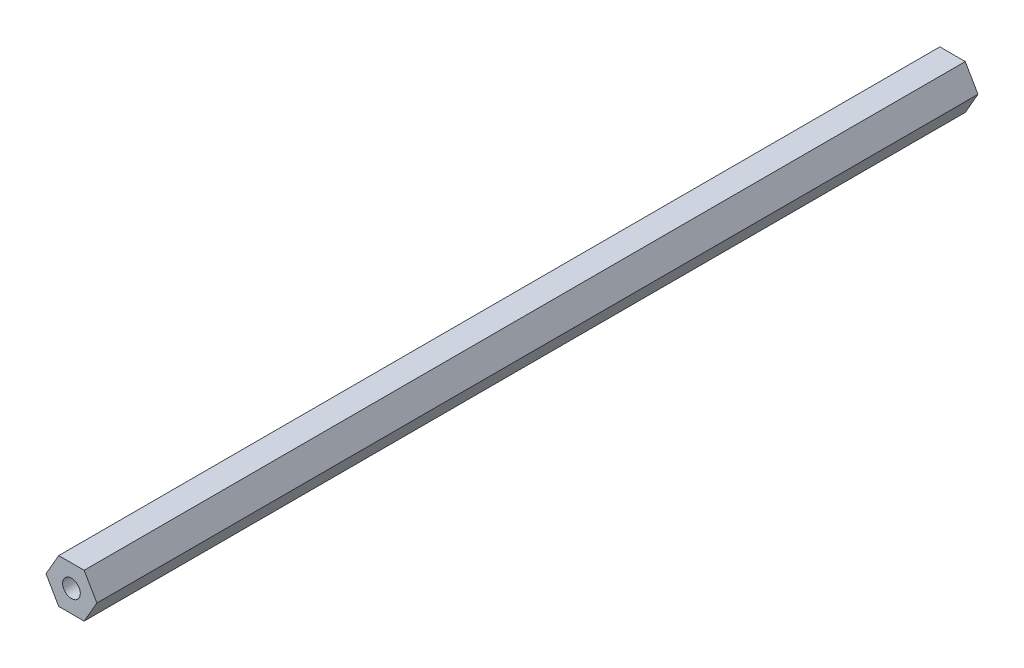
ISO-10303-21;
HEADER;
FILE_DESCRIPTION(('STEP AP214'),'2;1');
FILE_NAME('part.step','',(''),(''),'','','');
FILE_SCHEMA(('AUTOMOTIVE_DESIGN { 1 0 10303 214 1 1 1 1 }'));
ENDSEC;
DATA;
#1=APPLICATION_CONTEXT('core data for automotive mechanical design processes');
#2=APPLICATION_PROTOCOL_DEFINITION('international standard','automotive_design',2000,#1);
#3=PRODUCT_CONTEXT('',#1,'mechanical');
#4=PRODUCT('Part','Part','',(#3));
#5=PRODUCT_RELATED_PRODUCT_CATEGORY('part','',(#4));
#6=PRODUCT_DEFINITION_FORMATION('','',#4);
#7=PRODUCT_DEFINITION_CONTEXT('part definition',#1,'design');
#8=PRODUCT_DEFINITION('design','',#6,#7);
#9=PRODUCT_DEFINITION_SHAPE('','',#8);
#10=(LENGTH_UNIT() NAMED_UNIT(*) SI_UNIT(.MILLI.,.METRE.));
#11=(NAMED_UNIT(*) PLANE_ANGLE_UNIT() SI_UNIT($,.RADIAN.));
#12=(NAMED_UNIT(*) SI_UNIT($,.STERADIAN.) SOLID_ANGLE_UNIT());
#13=UNCERTAINTY_MEASURE_WITH_UNIT(LENGTH_MEASURE(1.E-05),#10,'distance_accuracy_value','');
#14=(GEOMETRIC_REPRESENTATION_CONTEXT(3) GLOBAL_UNCERTAINTY_ASSIGNED_CONTEXT((#13)) GLOBAL_UNIT_ASSIGNED_CONTEXT((#10,
#11,#12)) REPRESENTATION_CONTEXT('',''));
#15=CARTESIAN_POINT('',(0.,0.,0.));
#16=DIRECTION('',(0.,0.,1.));
#17=DIRECTION('',(1.,0.,0.));
#18=AXIS2_PLACEMENT_3D('',#15,#16,#17);
#19=CARTESIAN_POINT('',(0.,0.,254.));
#20=DIRECTION('',(0.,0.,1.));
#21=DIRECTION('',(1.,0.,0.));
#22=AXIS2_PLACEMENT_3D('',#19,#20,#21);
#23=PLANE('',#22);
#24=DIRECTION('',(0.499999999999995,0.866025403784441,0.));
#25=VECTOR('',#24,1.);
#26=CARTESIAN_POINT('',(3.66617420935418,-6.34999999999993,254.));
#27=LINE('',#26,#25);
#28=CARTESIAN_POINT('',(3.66617420935418,-6.34999999999993,254.));
#29=VERTEX_POINT('',#28);
#30=CARTESIAN_POINT('',(7.33234841870821,0.,254.));
#31=VERTEX_POINT('',#30);
#32=EDGE_CURVE('E135',#29,#31,#27,.T.);
#33=ORIENTED_EDGE('',*,*,#32,.T.);
#34=DIRECTION('',(-0.500000000000001,0.866025403784438,0.));
#35=VECTOR('',#34,1.);
#36=CARTESIAN_POINT('',(7.33234841870821,0.,254.));
#37=LINE('',#36,#35);
#38=CARTESIAN_POINT('',(3.66617420935409,6.34999999999998,254.));
#39=VERTEX_POINT('',#38);
#40=EDGE_CURVE('E93',#31,#39,#37,.T.);
#41=ORIENTED_EDGE('',*,*,#40,.T.);
#42=DIRECTION('',(-1.,0.,0.));
#43=VECTOR('',#42,1.);
#44=CARTESIAN_POINT('',(3.66617420935409,6.34999999999998,254.));
#45=LINE('',#44,#43);
#46=CARTESIAN_POINT('',(-3.66617420935413,6.34999999999995,254.));
#47=VERTEX_POINT('',#46);
#48=EDGE_CURVE('E106',#39,#47,#45,.T.);
#49=ORIENTED_EDGE('',*,*,#48,.T.);
#50=DIRECTION('',(-0.499999999999995,-0.866025403784442,0.));
#51=VECTOR('',#50,1.);
#52=CARTESIAN_POINT('',(-3.66617420935413,6.34999999999995,254.));
#53=LINE('',#52,#51);
#54=CARTESIAN_POINT('',(-7.33234841870821,0.,254.));
#55=VERTEX_POINT('',#54);
#56=EDGE_CURVE('E100',#47,#55,#53,.T.);
#57=ORIENTED_EDGE('',*,*,#56,.T.);
#58=DIRECTION('',(0.500000000000007,-0.866025403784435,0.));
#59=VECTOR('',#58,1.);
#60=CARTESIAN_POINT('',(-7.33234841870821,0.,254.));
#61=LINE('',#60,#59);
#62=CARTESIAN_POINT('',(-3.66617420935405,-6.35,254.));
#63=VERTEX_POINT('',#62);
#64=EDGE_CURVE('E104',#55,#63,#61,.T.);
#65=ORIENTED_EDGE('',*,*,#64,.T.);
#66=DIRECTION('',(1.,0.,0.));
#67=VECTOR('',#66,1.);
#68=CARTESIAN_POINT('',(-3.66617420935405,-6.35,254.));
#69=LINE('',#68,#67);
#70=EDGE_CURVE('E56',#63,#29,#69,.T.);
#71=ORIENTED_EDGE('',*,*,#70,.T.);
#72=EDGE_LOOP('',(#33,#41,#49,#57,#65,#71));
#73=FACE_BOUND('',#72,.T.);
#74=CARTESIAN_POINT('',(0.,0.,254.));
#75=DIRECTION('',(0.,0.,1.));
#76=DIRECTION('',(1.,0.,0.));
#77=AXIS2_PLACEMENT_3D('',#74,#75,#76);
#78=CIRCLE('',#77,2.5527);
#79=CARTESIAN_POINT('',(2.5527,0.,254.));
#80=VERTEX_POINT('',#79);
#81=EDGE_CURVE('E128',#80,#80,#78,.T.);
#82=ORIENTED_EDGE('',*,*,#81,.F.);
#83=EDGE_LOOP('',(#82));
#84=FACE_BOUND('',#83,.T.);
#85=ADVANCED_FACE('F39',(#73,#84),#23,.T.);
#86=CARTESIAN_POINT('',(0.,0.,0.));
#87=DIRECTION('',(0.,0.,1.));
#88=DIRECTION('',(1.,0.,0.));
#89=AXIS2_PLACEMENT_3D('',#86,#87,#88);
#90=PLANE('',#89);
#91=DIRECTION('',(0.499999999999995,0.866025403784441,0.));
#92=VECTOR('',#91,1.);
#93=CARTESIAN_POINT('',(3.66617420935418,-6.34999999999993,0.));
#94=LINE('',#93,#92);
#95=CARTESIAN_POINT('',(3.66617420935418,-6.34999999999993,0.));
#96=VERTEX_POINT('',#95);
#97=CARTESIAN_POINT('',(7.33234841870821,0.,0.));
#98=VERTEX_POINT('',#97);
#99=EDGE_CURVE('E124',#96,#98,#94,.T.);
#100=ORIENTED_EDGE('',*,*,#99,.F.);
#101=DIRECTION('',(1.,0.,0.));
#102=VECTOR('',#101,1.);
#103=CARTESIAN_POINT('',(-3.66617420935405,-6.35,0.));
#104=LINE('',#103,#102);
#105=CARTESIAN_POINT('',(-3.66617420935405,-6.35,0.));
#106=VERTEX_POINT('',#105);
#107=EDGE_CURVE('E85',#106,#96,#104,.T.);
#108=ORIENTED_EDGE('',*,*,#107,.F.);
#109=DIRECTION('',(0.500000000000007,-0.866025403784435,0.));
#110=VECTOR('',#109,1.);
#111=CARTESIAN_POINT('',(-7.33234841870821,0.,0.));
#112=LINE('',#111,#110);
#113=CARTESIAN_POINT('',(-7.33234841870821,0.,0.));
#114=VERTEX_POINT('',#113);
#115=EDGE_CURVE('E79',#114,#106,#112,.T.);
#116=ORIENTED_EDGE('',*,*,#115,.F.);
#117=DIRECTION('',(-0.499999999999995,-0.866025403784442,0.));
#118=VECTOR('',#117,1.);
#119=CARTESIAN_POINT('',(-3.66617420935413,6.34999999999995,0.));
#120=LINE('',#119,#118);
#121=CARTESIAN_POINT('',(-3.66617420935413,6.34999999999995,0.));
#122=VERTEX_POINT('',#121);
#123=EDGE_CURVE('E114',#122,#114,#120,.T.);
#124=ORIENTED_EDGE('',*,*,#123,.F.);
#125=DIRECTION('',(-1.,0.,0.));
#126=VECTOR('',#125,1.);
#127=CARTESIAN_POINT('',(3.66617420935409,6.34999999999998,0.));
#128=LINE('',#127,#126);
#129=CARTESIAN_POINT('',(3.66617420935409,6.34999999999998,0.));
#130=VERTEX_POINT('',#129);
#131=EDGE_CURVE('E130',#130,#122,#128,.T.);
#132=ORIENTED_EDGE('',*,*,#131,.F.);
#133=DIRECTION('',(-0.500000000000001,0.866025403784438,0.));
#134=VECTOR('',#133,1.);
#135=CARTESIAN_POINT('',(7.33234841870821,0.,0.));
#136=LINE('',#135,#134);
#137=EDGE_CURVE('E127',#98,#130,#136,.T.);
#138=ORIENTED_EDGE('',*,*,#137,.F.);
#139=EDGE_LOOP('',(#100,#108,#116,#124,#132,#138));
#140=FACE_BOUND('',#139,.T.);
#141=CARTESIAN_POINT('',(0.,0.,0.));
#142=DIRECTION('',(0.,0.,1.));
#143=DIRECTION('',(1.,0.,0.));
#144=AXIS2_PLACEMENT_3D('',#141,#142,#143);
#145=CIRCLE('',#144,2.5527);
#146=CARTESIAN_POINT('',(2.5527,0.,0.));
#147=VERTEX_POINT('',#146);
#148=EDGE_CURVE('E228',#147,#147,#145,.T.);
#149=ORIENTED_EDGE('',*,*,#148,.T.);
#150=EDGE_LOOP('',(#149));
#151=FACE_BOUND('',#150,.T.);
#152=ADVANCED_FACE('F144',(#140,#151),#90,.F.);
#153=CARTESIAN_POINT('',(3.66617420935418,-6.34999999999993,254.));
#154=DIRECTION('',(-0.866025403784441,0.499999999999995,0.));
#155=DIRECTION('',(-0.499999999999995,-0.866025403784442,0.));
#156=AXIS2_PLACEMENT_3D('',#153,#154,#155);
#157=PLANE('',#156);
#158=ORIENTED_EDGE('',*,*,#99,.T.);
#159=DIRECTION('',(0.,0.,-1.));
#160=VECTOR('',#159,1.);
#161=CARTESIAN_POINT('',(7.33234841870821,0.,254.));
#162=LINE('',#161,#160);
#163=EDGE_CURVE('E11',#31,#98,#162,.T.);
#164=ORIENTED_EDGE('',*,*,#163,.F.);
#165=ORIENTED_EDGE('',*,*,#32,.F.);
#166=DIRECTION('',(0.,0.,-1.));
#167=VECTOR('',#166,1.);
#168=CARTESIAN_POINT('',(3.66617420935418,-6.34999999999993,254.));
#169=LINE('',#168,#167);
#170=EDGE_CURVE('E120',#29,#96,#169,.T.);
#171=ORIENTED_EDGE('',*,*,#170,.T.);
#172=EDGE_LOOP('',(#158,#164,#165,#171));
#173=FACE_BOUND('',#172,.T.);
#174=ADVANCED_FACE('F41',(#173),#157,.F.);
#175=CARTESIAN_POINT('',(7.33234841870821,0.,254.));
#176=DIRECTION('',(-0.866025403784438,-0.500000000000001,0.));
#177=DIRECTION('',(0.500000000000001,-0.866025403784438,0.));
#178=AXIS2_PLACEMENT_3D('',#175,#176,#177);
#179=PLANE('',#178);
#180=ORIENTED_EDGE('',*,*,#137,.T.);
#181=DIRECTION('',(0.,0.,-1.));
#182=VECTOR('',#181,1.);
#183=CARTESIAN_POINT('',(3.66617420935409,6.34999999999998,254.));
#184=LINE('',#183,#182);
#185=EDGE_CURVE('E48',#39,#130,#184,.T.);
#186=ORIENTED_EDGE('',*,*,#185,.F.);
#187=ORIENTED_EDGE('',*,*,#40,.F.);
#188=ORIENTED_EDGE('',*,*,#163,.T.);
#189=EDGE_LOOP('',(#180,#186,#187,#188));
#190=FACE_BOUND('',#189,.T.);
#191=ADVANCED_FACE('F169',(#190),#179,.F.);
#192=CARTESIAN_POINT('',(3.66617420935409,6.34999999999998,254.));
#193=DIRECTION('',(0.,-1.,0.));
#194=DIRECTION('',(1.,0.,0.));
#195=AXIS2_PLACEMENT_3D('',#192,#193,#194);
#196=PLANE('',#195);
#197=ORIENTED_EDGE('',*,*,#131,.T.);
#198=DIRECTION('',(0.,0.,-1.));
#199=VECTOR('',#198,1.);
#200=CARTESIAN_POINT('',(-3.66617420935413,6.34999999999995,254.));
#201=LINE('',#200,#199);
#202=EDGE_CURVE('E115',#47,#122,#201,.T.);
#203=ORIENTED_EDGE('',*,*,#202,.F.);
#204=ORIENTED_EDGE('',*,*,#48,.F.);
#205=ORIENTED_EDGE('',*,*,#185,.T.);
#206=EDGE_LOOP('',(#197,#203,#204,#205));
#207=FACE_BOUND('',#206,.T.);
#208=ADVANCED_FACE('F141',(#207),#196,.F.);
#209=CARTESIAN_POINT('',(-3.66617420935413,6.34999999999995,254.));
#210=DIRECTION('',(0.866025403784442,-0.499999999999995,0.));
#211=DIRECTION('',(0.499999999999995,0.866025403784442,0.));
#212=AXIS2_PLACEMENT_3D('',#209,#210,#211);
#213=PLANE('',#212);
#214=ORIENTED_EDGE('',*,*,#123,.T.);
#215=DIRECTION('',(0.,0.,-1.));
#216=VECTOR('',#215,1.);
#217=CARTESIAN_POINT('',(-7.33234841870821,0.,254.));
#218=LINE('',#217,#216);
#219=EDGE_CURVE('E111',#55,#114,#218,.T.);
#220=ORIENTED_EDGE('',*,*,#219,.F.);
#221=ORIENTED_EDGE('',*,*,#56,.F.);
#222=ORIENTED_EDGE('',*,*,#202,.T.);
#223=EDGE_LOOP('',(#214,#220,#221,#222));
#224=FACE_BOUND('',#223,.T.);
#225=ADVANCED_FACE('F112',(#224),#213,.F.);
#226=CARTESIAN_POINT('',(-7.33234841870821,0.,254.));
#227=DIRECTION('',(0.866025403784435,0.500000000000007,0.));
#228=DIRECTION('',(-0.500000000000007,0.866025403784435,0.));
#229=AXIS2_PLACEMENT_3D('',#226,#227,#228);
#230=PLANE('',#229);
#231=ORIENTED_EDGE('',*,*,#115,.T.);
#232=DIRECTION('',(0.,0.,-1.));
#233=VECTOR('',#232,1.);
#234=CARTESIAN_POINT('',(-3.66617420935405,-6.35,254.));
#235=LINE('',#234,#233);
#236=EDGE_CURVE('E116',#63,#106,#235,.T.);
#237=ORIENTED_EDGE('',*,*,#236,.F.);
#238=ORIENTED_EDGE('',*,*,#64,.F.);
#239=ORIENTED_EDGE('',*,*,#219,.T.);
#240=EDGE_LOOP('',(#231,#237,#238,#239));
#241=FACE_BOUND('',#240,.T.);
#242=ADVANCED_FACE('F118',(#241),#230,.F.);
#243=CARTESIAN_POINT('',(-3.66617420935405,-6.35,254.));
#244=DIRECTION('',(0.,1.,0.));
#245=DIRECTION('',(-1.,0.,0.));
#246=AXIS2_PLACEMENT_3D('',#243,#244,#245);
#247=PLANE('',#246);
#248=ORIENTED_EDGE('',*,*,#107,.T.);
#249=ORIENTED_EDGE('',*,*,#170,.F.);
#250=ORIENTED_EDGE('',*,*,#70,.F.);
#251=ORIENTED_EDGE('',*,*,#236,.T.);
#252=EDGE_LOOP('',(#248,#249,#250,#251));
#253=FACE_BOUND('',#252,.T.);
#254=ADVANCED_FACE('F149',(#253),#247,.F.);
#255=CARTESIAN_POINT('',(0.,0.,254.));
#256=DIRECTION('',(0.,0.,-1.));
#257=DIRECTION('',(-1.,0.,0.));
#258=AXIS2_PLACEMENT_3D('',#255,#256,#257);
#259=CYLINDRICAL_SURFACE('',#258,2.5527);
#260=ORIENTED_EDGE('',*,*,#81,.T.);
#261=EDGE_LOOP('',(#260));
#262=FACE_BOUND('',#261,.T.);
#263=ORIENTED_EDGE('',*,*,#148,.F.);
#264=EDGE_LOOP('',(#263));
#265=FACE_BOUND('',#264,.T.);
#266=ADVANCED_FACE('F151',(#262,#265),#259,.F.);
#267=CLOSED_SHELL('',(#85,#152,#174,#191,#208,#225,#242,#254,#266));
#268=MANIFOLD_SOLID_BREP('B2',#267);
#269=ADVANCED_BREP_SHAPE_REPRESENTATION('',(#18,#268),#14);
#270=SHAPE_DEFINITION_REPRESENTATION(#9,#269);
ENDSEC;
END-ISO-10303-21;
